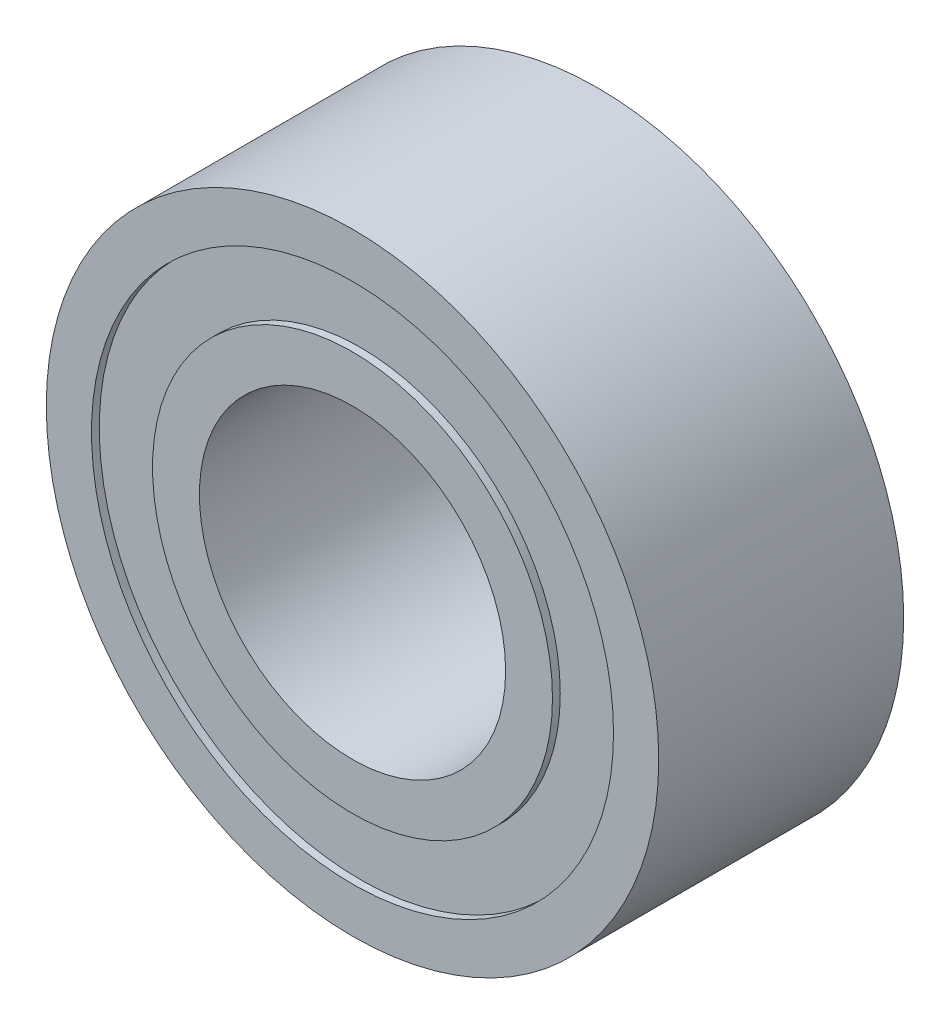
ISO-10303-21;
HEADER;
FILE_DESCRIPTION(('STEP AP214'),'2;1');
FILE_NAME('part.step','',(''),(''),'','','');
FILE_SCHEMA(('AUTOMOTIVE_DESIGN { 1 0 10303 214 1 1 1 1 }'));
ENDSEC;
DATA;
#1=APPLICATION_CONTEXT('core data for automotive mechanical design processes');
#2=APPLICATION_PROTOCOL_DEFINITION('international standard','automotive_design',2000,#1);
#3=PRODUCT_CONTEXT('',#1,'mechanical');
#4=PRODUCT('Part','Part','',(#3));
#5=PRODUCT_RELATED_PRODUCT_CATEGORY('part','',(#4));
#6=PRODUCT_DEFINITION_FORMATION('','',#4);
#7=PRODUCT_DEFINITION_CONTEXT('part definition',#1,'design');
#8=PRODUCT_DEFINITION('design','',#6,#7);
#9=PRODUCT_DEFINITION_SHAPE('','',#8);
#10=(LENGTH_UNIT() NAMED_UNIT(*) SI_UNIT(.MILLI.,.METRE.));
#11=(NAMED_UNIT(*) PLANE_ANGLE_UNIT() SI_UNIT($,.RADIAN.));
#12=(NAMED_UNIT(*) SI_UNIT($,.STERADIAN.) SOLID_ANGLE_UNIT());
#13=UNCERTAINTY_MEASURE_WITH_UNIT(LENGTH_MEASURE(1.E-05),#10,'distance_accuracy_value','');
#14=(GEOMETRIC_REPRESENTATION_CONTEXT(3) GLOBAL_UNCERTAINTY_ASSIGNED_CONTEXT((#13)) GLOBAL_UNIT_ASSIGNED_CONTEXT((#10,
#11,#12)) REPRESENTATION_CONTEXT('',''));
#15=CARTESIAN_POINT('',(0.,0.,0.));
#16=DIRECTION('',(0.,0.,1.));
#17=DIRECTION('',(1.,0.,0.));
#18=AXIS2_PLACEMENT_3D('',#15,#16,#17);
#19=CARTESIAN_POINT('',(0.,0.,0.));
#20=DIRECTION('',(0.,0.,1.));
#21=DIRECTION('',(1.,0.,0.));
#22=AXIS2_PLACEMENT_3D('',#19,#20,#21);
#23=PLANE('',#22);
#24=CARTESIAN_POINT('',(0.,0.,0.));
#25=DIRECTION('',(0.,0.,1.));
#26=DIRECTION('',(1.,0.,0.));
#27=AXIS2_PLACEMENT_3D('',#24,#25,#26);
#28=CIRCLE('',#27,2.5);
#29=CARTESIAN_POINT('',(2.5,0.,0.));
#30=VERTEX_POINT('',#29);
#31=EDGE_CURVE('E44',#30,#30,#28,.T.);
#32=ORIENTED_EDGE('',*,*,#31,.T.);
#33=EDGE_LOOP('',(#32));
#34=FACE_BOUND('',#33,.T.);
#35=CARTESIAN_POINT('',(0.,0.,0.));
#36=DIRECTION('',(0.,0.,-1.));
#37=DIRECTION('',(-1.,0.,0.));
#38=AXIS2_PLACEMENT_3D('',#35,#36,#37);
#39=CIRCLE('',#38,3.26532853466191);
#40=CARTESIAN_POINT('',(-3.26532853466191,0.,0.));
#41=VERTEX_POINT('',#40);
#42=EDGE_CURVE('E68',#41,#41,#39,.T.);
#43=ORIENTED_EDGE('',*,*,#42,.T.);
#44=EDGE_LOOP('',(#43));
#45=FACE_BOUND('',#44,.T.);
#46=ADVANCED_FACE('F31',(#34,#45),#23,.F.);
#47=CARTESIAN_POINT('',(0.,0.,4.));
#48=DIRECTION('',(0.,0.,1.));
#49=DIRECTION('',(1.,0.,0.));
#50=AXIS2_PLACEMENT_3D('',#47,#48,#49);
#51=PLANE('',#50);
#52=CARTESIAN_POINT('',(0.,0.,4.));
#53=DIRECTION('',(0.,0.,1.));
#54=DIRECTION('',(1.,0.,0.));
#55=AXIS2_PLACEMENT_3D('',#52,#53,#54);
#56=CIRCLE('',#55,2.5);
#57=CARTESIAN_POINT('',(2.5,0.,4.));
#58=VERTEX_POINT('',#57);
#59=EDGE_CURVE('E42',#58,#58,#56,.T.);
#60=ORIENTED_EDGE('',*,*,#59,.F.);
#61=EDGE_LOOP('',(#60));
#62=FACE_BOUND('',#61,.T.);
#63=CARTESIAN_POINT('',(0.,0.,4.));
#64=DIRECTION('',(0.,0.,1.));
#65=DIRECTION('',(1.,0.,0.));
#66=AXIS2_PLACEMENT_3D('',#63,#64,#65);
#67=CIRCLE('',#66,3.26532853466191);
#68=CARTESIAN_POINT('',(3.26532853466191,0.,4.));
#69=VERTEX_POINT('',#68);
#70=EDGE_CURVE('E56',#69,#69,#67,.T.);
#71=ORIENTED_EDGE('',*,*,#70,.T.);
#72=EDGE_LOOP('',(#71));
#73=FACE_BOUND('',#72,.T.);
#74=ADVANCED_FACE('F106',(#62,#73),#51,.T.);
#75=CARTESIAN_POINT('',(0.,0.,4.));
#76=DIRECTION('',(0.,0.,1.));
#77=DIRECTION('',(1.,0.,0.));
#78=AXIS2_PLACEMENT_3D('',#75,#76,#77);
#79=CIRCLE('',#78,4.26163486302059);
#80=CARTESIAN_POINT('',(4.26163486302059,0.,4.));
#81=VERTEX_POINT('',#80);
#82=EDGE_CURVE('E50',#81,#81,#79,.T.);
#83=ORIENTED_EDGE('',*,*,#82,.F.);
#84=EDGE_LOOP('',(#83));
#85=FACE_BOUND('',#84,.T.);
#86=CARTESIAN_POINT('',(0.,0.,4.));
#87=DIRECTION('',(0.,0.,1.));
#88=DIRECTION('',(1.,0.,0.));
#89=AXIS2_PLACEMENT_3D('',#86,#87,#88);
#90=CIRCLE('',#89,5.);
#91=CARTESIAN_POINT('',(5.,0.,4.));
#92=VERTEX_POINT('',#91);
#93=EDGE_CURVE('E10',#92,#92,#90,.T.);
#94=ORIENTED_EDGE('',*,*,#93,.T.);
#95=EDGE_LOOP('',(#94));
#96=FACE_BOUND('',#95,.T.);
#97=ADVANCED_FACE('F93',(#85,#96),#51,.T.);
#98=CARTESIAN_POINT('',(0.,0.,0.));
#99=DIRECTION('',(0.,0.,-1.));
#100=DIRECTION('',(-1.,0.,0.));
#101=AXIS2_PLACEMENT_3D('',#98,#99,#100);
#102=CIRCLE('',#101,4.26163486302059);
#103=CARTESIAN_POINT('',(-4.26163486302059,0.,0.));
#104=VERTEX_POINT('',#103);
#105=EDGE_CURVE('E62',#104,#104,#102,.T.);
#106=ORIENTED_EDGE('',*,*,#105,.F.);
#107=EDGE_LOOP('',(#106));
#108=FACE_BOUND('',#107,.T.);
#109=CARTESIAN_POINT('',(0.,0.,0.));
#110=DIRECTION('',(0.,0.,1.));
#111=DIRECTION('',(1.,0.,0.));
#112=AXIS2_PLACEMENT_3D('',#109,#110,#111);
#113=CIRCLE('',#112,5.);
#114=CARTESIAN_POINT('',(5.,0.,0.));
#115=VERTEX_POINT('',#114);
#116=EDGE_CURVE('E35',#115,#115,#113,.T.);
#117=ORIENTED_EDGE('',*,*,#116,.F.);
#118=EDGE_LOOP('',(#117));
#119=FACE_BOUND('',#118,.T.);
#120=ADVANCED_FACE('F90',(#108,#119),#23,.F.);
#121=CARTESIAN_POINT('',(0.,0.,4.));
#122=DIRECTION('',(0.,0.,-1.));
#123=DIRECTION('',(-1.,0.,0.));
#124=AXIS2_PLACEMENT_3D('',#121,#122,#123);
#125=CYLINDRICAL_SURFACE('',#124,5.);
#126=ORIENTED_EDGE('',*,*,#93,.F.);
#127=EDGE_LOOP('',(#126));
#128=FACE_BOUND('',#127,.T.);
#129=ORIENTED_EDGE('',*,*,#116,.T.);
#130=EDGE_LOOP('',(#129));
#131=FACE_BOUND('',#130,.T.);
#132=ADVANCED_FACE('F33',(#128,#131),#125,.T.);
#133=CARTESIAN_POINT('',(0.,0.,4.));
#134=DIRECTION('',(0.,0.,-1.));
#135=DIRECTION('',(-1.,0.,0.));
#136=AXIS2_PLACEMENT_3D('',#133,#134,#135);
#137=CYLINDRICAL_SURFACE('',#136,2.5);
#138=ORIENTED_EDGE('',*,*,#59,.T.);
#139=EDGE_LOOP('',(#138));
#140=FACE_BOUND('',#139,.T.);
#141=ORIENTED_EDGE('',*,*,#31,.F.);
#142=EDGE_LOOP('',(#141));
#143=FACE_BOUND('',#142,.T.);
#144=ADVANCED_FACE('F97',(#140,#143),#137,.F.);
#145=CARTESIAN_POINT('',(0.,0.,3.873));
#146=DIRECTION('',(0.,0.,1.));
#147=DIRECTION('',(1.,0.,0.));
#148=AXIS2_PLACEMENT_3D('',#145,#146,#147);
#149=CYLINDRICAL_SURFACE('',#148,4.26163486302059);
#150=CARTESIAN_POINT('',(0.,0.,3.873));
#151=DIRECTION('',(0.,0.,1.));
#152=DIRECTION('',(1.,0.,0.));
#153=AXIS2_PLACEMENT_3D('',#150,#151,#152);
#154=CIRCLE('',#153,4.26163486302059);
#155=CARTESIAN_POINT('',(4.26163486302059,0.,3.873));
#156=VERTEX_POINT('',#155);
#157=EDGE_CURVE('E47',#156,#156,#154,.T.);
#158=ORIENTED_EDGE('',*,*,#157,.F.);
#159=EDGE_LOOP('',(#158));
#160=FACE_BOUND('',#159,.T.);
#161=ORIENTED_EDGE('',*,*,#82,.T.);
#162=EDGE_LOOP('',(#161));
#163=FACE_BOUND('',#162,.T.);
#164=ADVANCED_FACE('F102',(#160,#163),#149,.F.);
#165=CARTESIAN_POINT('',(0.,0.,3.873));
#166=DIRECTION('',(0.,0.,1.));
#167=DIRECTION('',(1.,0.,0.));
#168=AXIS2_PLACEMENT_3D('',#165,#166,#167);
#169=PLANE('',#168);
#170=CARTESIAN_POINT('',(0.,0.,3.873));
#171=DIRECTION('',(0.,0.,1.));
#172=DIRECTION('',(1.,0.,0.));
#173=AXIS2_PLACEMENT_3D('',#170,#171,#172);
#174=CIRCLE('',#173,3.26532853466191);
#175=CARTESIAN_POINT('',(3.26532853466191,0.,3.873));
#176=VERTEX_POINT('',#175);
#177=EDGE_CURVE('E53',#176,#176,#174,.T.);
#178=ORIENTED_EDGE('',*,*,#177,.F.);
#179=EDGE_LOOP('',(#178));
#180=FACE_BOUND('',#179,.T.);
#181=ORIENTED_EDGE('',*,*,#157,.T.);
#182=EDGE_LOOP('',(#181));
#183=FACE_BOUND('',#182,.T.);
#184=ADVANCED_FACE('F119',(#180,#183),#169,.T.);
#185=CARTESIAN_POINT('',(0.,0.,3.873));
#186=DIRECTION('',(0.,0.,1.));
#187=DIRECTION('',(1.,0.,0.));
#188=AXIS2_PLACEMENT_3D('',#185,#186,#187);
#189=CYLINDRICAL_SURFACE('',#188,3.26532853466191);
#190=ORIENTED_EDGE('',*,*,#177,.T.);
#191=EDGE_LOOP('',(#190));
#192=FACE_BOUND('',#191,.T.);
#193=ORIENTED_EDGE('',*,*,#70,.F.);
#194=EDGE_LOOP('',(#193));
#195=FACE_BOUND('',#194,.T.);
#196=ADVANCED_FACE('F86',(#192,#195),#189,.T.);
#197=CARTESIAN_POINT('',(0.,0.,0.127));
#198=DIRECTION('',(0.,0.,-1.));
#199=DIRECTION('',(-1.,0.,0.));
#200=AXIS2_PLACEMENT_3D('',#197,#198,#199);
#201=CYLINDRICAL_SURFACE('',#200,4.26163486302059);
#202=CARTESIAN_POINT('',(0.,0.,0.127));
#203=DIRECTION('',(0.,0.,-1.));
#204=DIRECTION('',(-1.,0.,0.));
#205=AXIS2_PLACEMENT_3D('',#202,#203,#204);
#206=CIRCLE('',#205,4.26163486302059);
#207=CARTESIAN_POINT('',(-4.26163486302059,0.,0.127));
#208=VERTEX_POINT('',#207);
#209=EDGE_CURVE('E59',#208,#208,#206,.T.);
#210=ORIENTED_EDGE('',*,*,#209,.F.);
#211=EDGE_LOOP('',(#210));
#212=FACE_BOUND('',#211,.T.);
#213=ORIENTED_EDGE('',*,*,#105,.T.);
#214=EDGE_LOOP('',(#213));
#215=FACE_BOUND('',#214,.T.);
#216=ADVANCED_FACE('F80',(#212,#215),#201,.F.);
#217=CARTESIAN_POINT('',(0.,0.,0.127));
#218=DIRECTION('',(0.,0.,-1.));
#219=DIRECTION('',(-1.,0.,0.));
#220=AXIS2_PLACEMENT_3D('',#217,#218,#219);
#221=PLANE('',#220);
#222=CARTESIAN_POINT('',(0.,0.,0.127));
#223=DIRECTION('',(0.,0.,-1.));
#224=DIRECTION('',(-1.,0.,0.));
#225=AXIS2_PLACEMENT_3D('',#222,#223,#224);
#226=CIRCLE('',#225,3.26532853466191);
#227=CARTESIAN_POINT('',(-3.26532853466191,0.,0.127));
#228=VERTEX_POINT('',#227);
#229=EDGE_CURVE('E65',#228,#228,#226,.T.);
#230=ORIENTED_EDGE('',*,*,#229,.F.);
#231=EDGE_LOOP('',(#230));
#232=FACE_BOUND('',#231,.T.);
#233=ORIENTED_EDGE('',*,*,#209,.T.);
#234=EDGE_LOOP('',(#233));
#235=FACE_BOUND('',#234,.T.);
#236=ADVANCED_FACE('F77',(#232,#235),#221,.T.);
#237=CARTESIAN_POINT('',(0.,0.,0.127));
#238=DIRECTION('',(0.,0.,-1.));
#239=DIRECTION('',(-1.,0.,0.));
#240=AXIS2_PLACEMENT_3D('',#237,#238,#239);
#241=CYLINDRICAL_SURFACE('',#240,3.26532853466191);
#242=ORIENTED_EDGE('',*,*,#229,.T.);
#243=EDGE_LOOP('',(#242));
#244=FACE_BOUND('',#243,.T.);
#245=ORIENTED_EDGE('',*,*,#42,.F.);
#246=EDGE_LOOP('',(#245));
#247=FACE_BOUND('',#246,.T.);
#248=ADVANCED_FACE('F74',(#244,#247),#241,.T.);
#249=CLOSED_SHELL('',(#46,#74,#97,#120,#132,#144,#164,#184,#196,#216,#236,#248));
#250=MANIFOLD_SOLID_BREP('B2',#249);
#251=ADVANCED_BREP_SHAPE_REPRESENTATION('',(#18,#250),#14);
#252=SHAPE_DEFINITION_REPRESENTATION(#9,#251);
ENDSEC;
END-ISO-10303-21;
